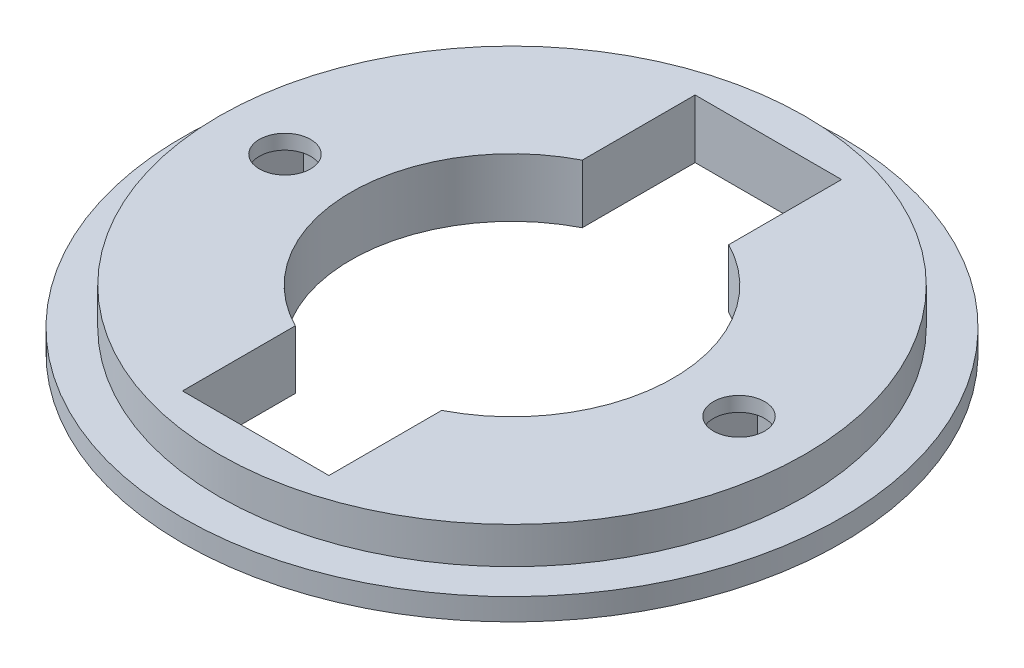
ISO-10303-21;
HEADER;
FILE_DESCRIPTION(('STEP AP214'),'2;1');
FILE_NAME('part.step','',(''),(''),'','','');
FILE_SCHEMA(('AUTOMOTIVE_DESIGN { 1 0 10303 214 1 1 1 1 }'));
ENDSEC;
DATA;
#1=APPLICATION_CONTEXT('core data for automotive mechanical design processes');
#2=APPLICATION_PROTOCOL_DEFINITION('international standard','automotive_design',2000,#1);
#3=PRODUCT_CONTEXT('',#1,'mechanical');
#4=PRODUCT('Part','Part','',(#3));
#5=PRODUCT_RELATED_PRODUCT_CATEGORY('part','',(#4));
#6=PRODUCT_DEFINITION_FORMATION('','',#4);
#7=PRODUCT_DEFINITION_CONTEXT('part definition',#1,'design');
#8=PRODUCT_DEFINITION('design','',#6,#7);
#9=PRODUCT_DEFINITION_SHAPE('','',#8);
#10=(LENGTH_UNIT() NAMED_UNIT(*) SI_UNIT(.MILLI.,.METRE.));
#11=(NAMED_UNIT(*) PLANE_ANGLE_UNIT() SI_UNIT($,.RADIAN.));
#12=(NAMED_UNIT(*) SI_UNIT($,.STERADIAN.) SOLID_ANGLE_UNIT());
#13=UNCERTAINTY_MEASURE_WITH_UNIT(LENGTH_MEASURE(1.E-05),#10,'distance_accuracy_value','');
#14=(GEOMETRIC_REPRESENTATION_CONTEXT(3) GLOBAL_UNCERTAINTY_ASSIGNED_CONTEXT((#13)) GLOBAL_UNIT_ASSIGNED_CONTEXT((#10,
#11,#12)) REPRESENTATION_CONTEXT('',''));
#15=CARTESIAN_POINT('',(0.,0.,0.));
#16=DIRECTION('',(0.,0.,1.));
#17=DIRECTION('',(1.,0.,0.));
#18=AXIS2_PLACEMENT_3D('',#15,#16,#17);
#19=CARTESIAN_POINT('',(-15.5,0.,0.));
#20=DIRECTION('',(0.,1.,0.));
#21=DIRECTION('',(0.,0.,1.));
#22=AXIS2_PLACEMENT_3D('',#19,#20,#21);
#23=CYLINDRICAL_SURFACE('',#22,1.75);
#24=CARTESIAN_POINT('',(-15.5,4.,0.));
#25=DIRECTION('',(0.,1.,0.));
#26=DIRECTION('',(0.,0.,-1.));
#27=AXIS2_PLACEMENT_3D('',#24,#25,#26);
#28=CIRCLE('',#27,1.75);
#29=CARTESIAN_POINT('',(-15.5,4.,-1.75));
#30=VERTEX_POINT('',#29);
#31=EDGE_CURVE('E274',#30,#30,#28,.T.);
#32=ORIENTED_EDGE('',*,*,#31,.T.);
#33=EDGE_LOOP('',(#32));
#34=FACE_BOUND('',#33,.T.);
#35=CARTESIAN_POINT('',(-15.5,3.,0.));
#36=DIRECTION('',(0.,-1.,0.));
#37=DIRECTION('',(0.,0.,-1.));
#38=AXIS2_PLACEMENT_3D('',#35,#36,#37);
#39=CIRCLE('',#38,1.75);
#40=CARTESIAN_POINT('',(-15.5,3.,-1.75));
#41=VERTEX_POINT('',#40);
#42=EDGE_CURVE('E264',#41,#41,#39,.F.);
#43=ORIENTED_EDGE('',*,*,#42,.F.);
#44=EDGE_LOOP('',(#43));
#45=FACE_BOUND('',#44,.T.);
#46=ADVANCED_FACE('F33',(#34,#45),#23,.F.);
#47=CARTESIAN_POINT('',(0.,4.,0.));
#48=DIRECTION('',(0.,-1.,0.));
#49=DIRECTION('',(0.,0.,-1.));
#50=AXIS2_PLACEMENT_3D('',#47,#48,#49);
#51=CYLINDRICAL_SURFACE('',#50,22.5);
#52=CARTESIAN_POINT('',(0.,0.,0.));
#53=DIRECTION('',(0.,1.,0.));
#54=DIRECTION('',(0.,0.,1.));
#55=AXIS2_PLACEMENT_3D('',#52,#53,#54);
#56=CIRCLE('',#55,22.5);
#57=CARTESIAN_POINT('',(0.,0.,22.5));
#58=VERTEX_POINT('',#57);
#59=EDGE_CURVE('E11',#58,#58,#56,.T.);
#60=ORIENTED_EDGE('',*,*,#59,.T.);
#61=EDGE_LOOP('',(#60));
#62=FACE_BOUND('',#61,.T.);
#63=CARTESIAN_POINT('',(0.,1.5,0.));
#64=DIRECTION('',(0.,1.,0.));
#65=DIRECTION('',(0.,0.,1.));
#66=AXIS2_PLACEMENT_3D('',#63,#64,#65);
#67=CIRCLE('',#66,22.5);
#68=CARTESIAN_POINT('',(0.,1.5,22.5));
#69=VERTEX_POINT('',#68);
#70=EDGE_CURVE('E42',#69,#69,#67,.T.);
#71=ORIENTED_EDGE('',*,*,#70,.F.);
#72=EDGE_LOOP('',(#71));
#73=FACE_BOUND('',#72,.T.);
#74=ADVANCED_FACE('F35',(#62,#73),#51,.T.);
#75=CARTESIAN_POINT('',(0.,0.,0.));
#76=DIRECTION('',(0.,1.,0.));
#77=DIRECTION('',(0.,0.,1.));
#78=AXIS2_PLACEMENT_3D('',#75,#76,#77);
#79=PLANE('',#78);
#80=DIRECTION('',(0.500000000000001,0.,0.866025403784438));
#81=VECTOR('',#80,1.);
#82=CARTESIAN_POINT('',(18.9641016151377,0.,0.));
#83=LINE('',#82,#81);
#84=CARTESIAN_POINT('',(17.2320508075689,0.,-3.));
#85=VERTEX_POINT('',#84);
#86=CARTESIAN_POINT('',(18.9641016151377,0.,0.));
#87=VERTEX_POINT('',#86);
#88=EDGE_CURVE('E208',#85,#87,#83,.T.);
#89=ORIENTED_EDGE('',*,*,#88,.F.);
#90=DIRECTION('',(1.,0.,0.));
#91=VECTOR('',#90,1.);
#92=CARTESIAN_POINT('',(17.2320508075689,0.,-3.));
#93=LINE('',#92,#91);
#94=CARTESIAN_POINT('',(13.7679491924311,0.,-3.));
#95=VERTEX_POINT('',#94);
#96=EDGE_CURVE('E50',#95,#85,#93,.T.);
#97=ORIENTED_EDGE('',*,*,#96,.F.);
#98=DIRECTION('',(0.5,0.,-0.866025403784439));
#99=VECTOR('',#98,1.);
#100=CARTESIAN_POINT('',(13.7679491924311,0.,-3.));
#101=LINE('',#100,#99);
#102=CARTESIAN_POINT('',(12.0358983848622,0.,0.));
#103=VERTEX_POINT('',#102);
#104=EDGE_CURVE('E194',#103,#95,#101,.T.);
#105=ORIENTED_EDGE('',*,*,#104,.F.);
#106=DIRECTION('',(-0.5,0.,-0.866025403784438));
#107=VECTOR('',#106,1.);
#108=CARTESIAN_POINT('',(12.0358983848622,0.,0.));
#109=LINE('',#108,#107);
#110=CARTESIAN_POINT('',(13.7679491924311,0.,2.99999999999999));
#111=VERTEX_POINT('',#110);
#112=EDGE_CURVE('E197',#111,#103,#109,.T.);
#113=ORIENTED_EDGE('',*,*,#112,.F.);
#114=DIRECTION('',(-1.,0.,0.));
#115=VECTOR('',#114,1.);
#116=CARTESIAN_POINT('',(13.7679491924311,0.,2.99999999999999));
#117=LINE('',#116,#115);
#118=CARTESIAN_POINT('',(17.2320508075689,0.,2.99999999999999));
#119=VERTEX_POINT('',#118);
#120=EDGE_CURVE('E213',#119,#111,#117,.T.);
#121=ORIENTED_EDGE('',*,*,#120,.F.);
#122=DIRECTION('',(-0.5,0.,0.866025403784439));
#123=VECTOR('',#122,1.);
#124=CARTESIAN_POINT('',(17.2320508075689,0.,2.99999999999999));
#125=LINE('',#124,#123);
#126=EDGE_CURVE('E210',#87,#119,#125,.T.);
#127=ORIENTED_EDGE('',*,*,#126,.F.);
#128=EDGE_LOOP('',(#89,#97,#105,#113,#121,#127));
#129=FACE_BOUND('',#128,.T.);
#130=DIRECTION('',(-0.5,0.,0.866025403784438));
#131=VECTOR('',#130,1.);
#132=CARTESIAN_POINT('',(-12.0358983848622,0.,0.));
#133=LINE('',#132,#131);
#134=CARTESIAN_POINT('',(-12.0358983848622,0.,0.));
#135=VERTEX_POINT('',#134);
#136=CARTESIAN_POINT('',(-13.7679491924311,0.,2.99999999999999));
#137=VERTEX_POINT('',#136);
#138=EDGE_CURVE('E248',#135,#137,#133,.T.);
#139=ORIENTED_EDGE('',*,*,#138,.F.);
#140=DIRECTION('',(0.5,0.,0.866025403784439));
#141=VECTOR('',#140,1.);
#142=CARTESIAN_POINT('',(-13.7679491924311,0.,-3.));
#143=LINE('',#142,#141);
#144=CARTESIAN_POINT('',(-13.7679491924311,0.,-3.));
#145=VERTEX_POINT('',#144);
#146=EDGE_CURVE('E58',#145,#135,#143,.T.);
#147=ORIENTED_EDGE('',*,*,#146,.F.);
#148=DIRECTION('',(1.,0.,0.));
#149=VECTOR('',#148,1.);
#150=CARTESIAN_POINT('',(-17.2320508075689,0.,-3.));
#151=LINE('',#150,#149);
#152=CARTESIAN_POINT('',(-17.2320508075689,0.,-3.));
#153=VERTEX_POINT('',#152);
#154=EDGE_CURVE('E231',#153,#145,#151,.T.);
#155=ORIENTED_EDGE('',*,*,#154,.F.);
#156=DIRECTION('',(0.500000000000001,0.,-0.866025403784438));
#157=VECTOR('',#156,1.);
#158=CARTESIAN_POINT('',(-18.9641016151377,0.,0.));
#159=LINE('',#158,#157);
#160=CARTESIAN_POINT('',(-18.9641016151377,0.,0.));
#161=VERTEX_POINT('',#160);
#162=EDGE_CURVE('E257',#161,#153,#159,.T.);
#163=ORIENTED_EDGE('',*,*,#162,.F.);
#164=DIRECTION('',(-0.5,0.,-0.866025403784439));
#165=VECTOR('',#164,1.);
#166=CARTESIAN_POINT('',(-17.2320508075689,0.,2.99999999999999));
#167=LINE('',#166,#165);
#168=CARTESIAN_POINT('',(-17.2320508075689,0.,2.99999999999999));
#169=VERTEX_POINT('',#168);
#170=EDGE_CURVE('E254',#169,#161,#167,.T.);
#171=ORIENTED_EDGE('',*,*,#170,.F.);
#172=DIRECTION('',(-1.,0.,0.));
#173=VECTOR('',#172,1.);
#174=CARTESIAN_POINT('',(-13.7679491924311,0.,2.99999999999999));
#175=LINE('',#174,#173);
#176=EDGE_CURVE('E251',#137,#169,#175,.T.);
#177=ORIENTED_EDGE('',*,*,#176,.F.);
#178=EDGE_LOOP('',(#139,#147,#155,#163,#171,#177));
#179=FACE_BOUND('',#178,.T.);
#180=DIRECTION('',(0.,0.,1.));
#181=VECTOR('',#180,1.);
#182=CARTESIAN_POINT('',(-5.,0.,9.79795897113272));
#183=LINE('',#182,#181);
#184=CARTESIAN_POINT('',(-5.,0.,9.79795897113271));
#185=VERTEX_POINT('',#184);
#186=CARTESIAN_POINT('',(-5.,0.,17.5));
#187=VERTEX_POINT('',#186);
#188=EDGE_CURVE('E303',#185,#187,#183,.T.);
#189=ORIENTED_EDGE('',*,*,#188,.T.);
#190=DIRECTION('',(1.,0.,0.));
#191=VECTOR('',#190,1.);
#192=CARTESIAN_POINT('',(-5.,0.,17.5));
#193=LINE('',#192,#191);
#194=CARTESIAN_POINT('',(5.,0.,17.5));
#195=VERTEX_POINT('',#194);
#196=EDGE_CURVE('E281',#187,#195,#193,.T.);
#197=ORIENTED_EDGE('',*,*,#196,.T.);
#198=DIRECTION('',(0.,0.,-1.));
#199=VECTOR('',#198,1.);
#200=CARTESIAN_POINT('',(5.,0.,9.79795897113272));
#201=LINE('',#200,#199);
#202=CARTESIAN_POINT('',(5.,0.,9.79795897113272));
#203=VERTEX_POINT('',#202);
#204=EDGE_CURVE('E284',#195,#203,#201,.T.);
#205=ORIENTED_EDGE('',*,*,#204,.T.);
#206=CARTESIAN_POINT('',(0.,0.,0.));
#207=DIRECTION('',(0.,1.,0.));
#208=DIRECTION('',(0.,0.,1.));
#209=AXIS2_PLACEMENT_3D('',#206,#207,#208);
#210=CIRCLE('',#209,11.);
#211=CARTESIAN_POINT('',(5.,0.,-9.79795897113272));
#212=VERTEX_POINT('',#211);
#213=EDGE_CURVE('E288',#203,#212,#210,.T.);
#214=ORIENTED_EDGE('',*,*,#213,.T.);
#215=DIRECTION('',(0.,0.,-1.));
#216=VECTOR('',#215,1.);
#217=CARTESIAN_POINT('',(5.,0.,-17.5));
#218=LINE('',#217,#216);
#219=CARTESIAN_POINT('',(5.,0.,-17.5));
#220=VERTEX_POINT('',#219);
#221=EDGE_CURVE('E291',#212,#220,#218,.T.);
#222=ORIENTED_EDGE('',*,*,#221,.T.);
#223=DIRECTION('',(-1.,0.,0.));
#224=VECTOR('',#223,1.);
#225=CARTESIAN_POINT('',(-5.,0.,-17.5));
#226=LINE('',#225,#224);
#227=CARTESIAN_POINT('',(-5.,0.,-17.5));
#228=VERTEX_POINT('',#227);
#229=EDGE_CURVE('E294',#220,#228,#226,.T.);
#230=ORIENTED_EDGE('',*,*,#229,.T.);
#231=DIRECTION('',(0.,0.,1.));
#232=VECTOR('',#231,1.);
#233=CARTESIAN_POINT('',(-5.,0.,-17.5));
#234=LINE('',#233,#232);
#235=CARTESIAN_POINT('',(-5.,0.,-9.79795897113271));
#236=VERTEX_POINT('',#235);
#237=EDGE_CURVE('E297',#228,#236,#234,.T.);
#238=ORIENTED_EDGE('',*,*,#237,.T.);
#239=CARTESIAN_POINT('',(0.,0.,0.));
#240=DIRECTION('',(0.,1.,0.));
#241=DIRECTION('',(0.,0.,1.));
#242=AXIS2_PLACEMENT_3D('',#239,#240,#241);
#243=CIRCLE('',#242,11.);
#244=EDGE_CURVE('E300',#236,#185,#243,.T.);
#245=ORIENTED_EDGE('',*,*,#244,.T.);
#246=EDGE_LOOP('',(#189,#197,#205,#214,#222,#230,#238,#245));
#247=FACE_BOUND('',#246,.T.);
#248=ORIENTED_EDGE('',*,*,#59,.F.);
#249=EDGE_LOOP('',(#248));
#250=FACE_BOUND('',#249,.T.);
#251=ADVANCED_FACE('F364',(#129,#179,#247,#250),#79,.F.);
#252=CARTESIAN_POINT('',(0.,1.5,0.));
#253=DIRECTION('',(0.,1.,0.));
#254=DIRECTION('',(0.,0.,1.));
#255=AXIS2_PLACEMENT_3D('',#252,#253,#254);
#256=PLANE('',#255);
#257=CARTESIAN_POINT('',(0.,1.5,0.));
#258=DIRECTION('',(0.,1.,0.));
#259=DIRECTION('',(0.,0.,1.));
#260=AXIS2_PLACEMENT_3D('',#257,#258,#259);
#261=CIRCLE('',#260,20.);
#262=CARTESIAN_POINT('',(0.,1.5,20.));
#263=VERTEX_POINT('',#262);
#264=EDGE_CURVE('E345',#263,#263,#261,.T.);
#265=ORIENTED_EDGE('',*,*,#264,.F.);
#266=EDGE_LOOP('',(#265));
#267=FACE_BOUND('',#266,.T.);
#268=ORIENTED_EDGE('',*,*,#70,.T.);
#269=EDGE_LOOP('',(#268));
#270=FACE_BOUND('',#269,.T.);
#271=ADVANCED_FACE('F408',(#267,#270),#256,.T.);
#272=CARTESIAN_POINT('',(0.,1.5,0.));
#273=DIRECTION('',(0.,1.,0.));
#274=DIRECTION('',(0.,0.,1.));
#275=AXIS2_PLACEMENT_3D('',#272,#273,#274);
#276=CYLINDRICAL_SURFACE('',#275,20.);
#277=ORIENTED_EDGE('',*,*,#264,.T.);
#278=EDGE_LOOP('',(#277));
#279=FACE_BOUND('',#278,.T.);
#280=CARTESIAN_POINT('',(0.,4.,0.));
#281=DIRECTION('',(0.,1.,0.));
#282=DIRECTION('',(0.,0.,1.));
#283=AXIS2_PLACEMENT_3D('',#280,#281,#282);
#284=CIRCLE('',#283,20.);
#285=CARTESIAN_POINT('',(0.,4.,20.));
#286=VERTEX_POINT('',#285);
#287=EDGE_CURVE('E330',#286,#286,#284,.T.);
#288=ORIENTED_EDGE('',*,*,#287,.F.);
#289=EDGE_LOOP('',(#288));
#290=FACE_BOUND('',#289,.T.);
#291=ADVANCED_FACE('F405',(#279,#290),#276,.T.);
#292=CARTESIAN_POINT('',(0.,4.,0.));
#293=DIRECTION('',(0.,1.,0.));
#294=DIRECTION('',(0.,0.,1.));
#295=AXIS2_PLACEMENT_3D('',#292,#293,#294);
#296=PLANE('',#295);
#297=ORIENTED_EDGE('',*,*,#31,.F.);
#298=EDGE_LOOP('',(#297));
#299=FACE_BOUND('',#298,.T.);
#300=CARTESIAN_POINT('',(15.5,4.,0.));
#301=DIRECTION('',(0.,1.,0.));
#302=DIRECTION('',(0.,0.,1.));
#303=AXIS2_PLACEMENT_3D('',#300,#301,#302);
#304=CIRCLE('',#303,1.75);
#305=CARTESIAN_POINT('',(15.5,4.,1.75));
#306=VERTEX_POINT('',#305);
#307=EDGE_CURVE('E277',#306,#306,#304,.T.);
#308=ORIENTED_EDGE('',*,*,#307,.F.);
#309=EDGE_LOOP('',(#308));
#310=FACE_BOUND('',#309,.T.);
#311=DIRECTION('',(1.,0.,0.));
#312=VECTOR('',#311,1.);
#313=CARTESIAN_POINT('',(-5.,4.,17.5));
#314=LINE('',#313,#312);
#315=CARTESIAN_POINT('',(-5.,4.,17.5));
#316=VERTEX_POINT('',#315);
#317=CARTESIAN_POINT('',(5.,4.,17.5));
#318=VERTEX_POINT('',#317);
#319=EDGE_CURVE('E280',#316,#318,#314,.T.);
#320=ORIENTED_EDGE('',*,*,#319,.F.);
#321=DIRECTION('',(0.,0.,1.));
#322=VECTOR('',#321,1.);
#323=CARTESIAN_POINT('',(-5.,4.,9.79795897113272));
#324=LINE('',#323,#322);
#325=CARTESIAN_POINT('',(-5.,4.,9.79795897113271));
#326=VERTEX_POINT('',#325);
#327=EDGE_CURVE('E285',#326,#316,#324,.T.);
#328=ORIENTED_EDGE('',*,*,#327,.F.);
#329=CARTESIAN_POINT('',(0.,4.,0.));
#330=DIRECTION('',(0.,1.,0.));
#331=DIRECTION('',(0.,0.,1.));
#332=AXIS2_PLACEMENT_3D('',#329,#330,#331);
#333=CIRCLE('',#332,11.);
#334=CARTESIAN_POINT('',(-5.,4.,-9.79795897113271));
#335=VERTEX_POINT('',#334);
#336=EDGE_CURVE('E323',#335,#326,#333,.T.);
#337=ORIENTED_EDGE('',*,*,#336,.F.);
#338=DIRECTION('',(0.,0.,1.));
#339=VECTOR('',#338,1.);
#340=CARTESIAN_POINT('',(-5.,4.,-17.5));
#341=LINE('',#340,#339);
#342=CARTESIAN_POINT('',(-5.,4.,-17.5));
#343=VERTEX_POINT('',#342);
#344=EDGE_CURVE('E320',#343,#335,#341,.T.);
#345=ORIENTED_EDGE('',*,*,#344,.F.);
#346=DIRECTION('',(-1.,0.,0.));
#347=VECTOR('',#346,1.);
#348=CARTESIAN_POINT('',(-5.,4.,-17.5));
#349=LINE('',#348,#347);
#350=CARTESIAN_POINT('',(5.,4.,-17.5));
#351=VERTEX_POINT('',#350);
#352=EDGE_CURVE('E317',#351,#343,#349,.T.);
#353=ORIENTED_EDGE('',*,*,#352,.F.);
#354=DIRECTION('',(0.,0.,-1.));
#355=VECTOR('',#354,1.);
#356=CARTESIAN_POINT('',(5.,4.,-17.5));
#357=LINE('',#356,#355);
#358=CARTESIAN_POINT('',(5.,4.,-9.79795897113272));
#359=VERTEX_POINT('',#358);
#360=EDGE_CURVE('E314',#359,#351,#357,.T.);
#361=ORIENTED_EDGE('',*,*,#360,.F.);
#362=CARTESIAN_POINT('',(0.,4.,0.));
#363=DIRECTION('',(0.,1.,0.));
#364=DIRECTION('',(0.,0.,1.));
#365=AXIS2_PLACEMENT_3D('',#362,#363,#364);
#366=CIRCLE('',#365,11.);
#367=CARTESIAN_POINT('',(5.,4.,9.79795897113272));
#368=VERTEX_POINT('',#367);
#369=EDGE_CURVE('E311',#368,#359,#366,.T.);
#370=ORIENTED_EDGE('',*,*,#369,.F.);
#371=DIRECTION('',(0.,0.,-1.));
#372=VECTOR('',#371,1.);
#373=CARTESIAN_POINT('',(5.,4.,9.79795897113272));
#374=LINE('',#373,#372);
#375=EDGE_CURVE('E308',#318,#368,#374,.T.);
#376=ORIENTED_EDGE('',*,*,#375,.F.);
#377=EDGE_LOOP('',(#320,#328,#337,#345,#353,#361,#370,#376));
#378=FACE_BOUND('',#377,.T.);
#379=ORIENTED_EDGE('',*,*,#287,.T.);
#380=EDGE_LOOP('',(#379));
#381=FACE_BOUND('',#380,.T.);
#382=ADVANCED_FACE('F403',(#299,#310,#378,#381),#296,.T.);
#383=CARTESIAN_POINT('',(-5.,0.,17.5));
#384=DIRECTION('',(0.,0.,1.));
#385=DIRECTION('',(1.,0.,0.));
#386=AXIS2_PLACEMENT_3D('',#383,#384,#385);
#387=PLANE('',#386);
#388=ORIENTED_EDGE('',*,*,#319,.T.);
#389=DIRECTION('',(0.,1.,0.));
#390=VECTOR('',#389,1.);
#391=CARTESIAN_POINT('',(5.,0.,17.5));
#392=LINE('',#391,#390);
#393=EDGE_CURVE('E306',#195,#318,#392,.T.);
#394=ORIENTED_EDGE('',*,*,#393,.F.);
#395=ORIENTED_EDGE('',*,*,#196,.F.);
#396=DIRECTION('',(0.,1.,0.));
#397=VECTOR('',#396,1.);
#398=CARTESIAN_POINT('',(-5.,0.,17.5));
#399=LINE('',#398,#397);
#400=EDGE_CURVE('E328',#187,#316,#399,.T.);
#401=ORIENTED_EDGE('',*,*,#400,.T.);
#402=EDGE_LOOP('',(#388,#394,#395,#401));
#403=FACE_BOUND('',#402,.T.);
#404=ADVANCED_FACE('F378',(#403),#387,.F.);
#405=CARTESIAN_POINT('',(-5.,0.,9.79795897113272));
#406=DIRECTION('',(-1.,0.,0.));
#407=DIRECTION('',(0.,0.,1.));
#408=AXIS2_PLACEMENT_3D('',#405,#406,#407);
#409=PLANE('',#408);
#410=ORIENTED_EDGE('',*,*,#327,.T.);
#411=ORIENTED_EDGE('',*,*,#400,.F.);
#412=ORIENTED_EDGE('',*,*,#188,.F.);
#413=DIRECTION('',(0.,1.,0.));
#414=VECTOR('',#413,1.);
#415=CARTESIAN_POINT('',(-5.,0.,9.79795897113271));
#416=LINE('',#415,#414);
#417=EDGE_CURVE('E331',#185,#326,#416,.T.);
#418=ORIENTED_EDGE('',*,*,#417,.T.);
#419=EDGE_LOOP('',(#410,#411,#412,#418));
#420=FACE_BOUND('',#419,.T.);
#421=ADVANCED_FACE('F374',(#420),#409,.F.);
#422=CARTESIAN_POINT('',(0.,0.,0.));
#423=DIRECTION('',(0.,1.,0.));
#424=DIRECTION('',(0.,0.,1.));
#425=AXIS2_PLACEMENT_3D('',#422,#423,#424);
#426=CYLINDRICAL_SURFACE('',#425,11.);
#427=ORIENTED_EDGE('',*,*,#336,.T.);
#428=ORIENTED_EDGE('',*,*,#417,.F.);
#429=ORIENTED_EDGE('',*,*,#244,.F.);
#430=DIRECTION('',(0.,1.,0.));
#431=VECTOR('',#430,1.);
#432=CARTESIAN_POINT('',(-5.,0.,-9.79795897113271));
#433=LINE('',#432,#431);
#434=EDGE_CURVE('E333',#236,#335,#433,.T.);
#435=ORIENTED_EDGE('',*,*,#434,.T.);
#436=EDGE_LOOP('',(#427,#428,#429,#435));
#437=FACE_BOUND('',#436,.T.);
#438=ADVANCED_FACE('F377',(#437),#426,.F.);
#439=CARTESIAN_POINT('',(-5.,0.,-17.5));
#440=DIRECTION('',(-1.,0.,0.));
#441=DIRECTION('',(0.,0.,1.));
#442=AXIS2_PLACEMENT_3D('',#439,#440,#441);
#443=PLANE('',#442);
#444=ORIENTED_EDGE('',*,*,#344,.T.);
#445=ORIENTED_EDGE('',*,*,#434,.F.);
#446=ORIENTED_EDGE('',*,*,#237,.F.);
#447=DIRECTION('',(0.,1.,0.));
#448=VECTOR('',#447,1.);
#449=CARTESIAN_POINT('',(-5.,0.,-17.5));
#450=LINE('',#449,#448);
#451=EDGE_CURVE('E335',#228,#343,#450,.T.);
#452=ORIENTED_EDGE('',*,*,#451,.T.);
#453=EDGE_LOOP('',(#444,#445,#446,#452));
#454=FACE_BOUND('',#453,.T.);
#455=ADVANCED_FACE('F382',(#454),#443,.F.);
#456=CARTESIAN_POINT('',(-5.,0.,-17.5));
#457=DIRECTION('',(0.,0.,-1.));
#458=DIRECTION('',(-1.,0.,0.));
#459=AXIS2_PLACEMENT_3D('',#456,#457,#458);
#460=PLANE('',#459);
#461=ORIENTED_EDGE('',*,*,#352,.T.);
#462=ORIENTED_EDGE('',*,*,#451,.F.);
#463=ORIENTED_EDGE('',*,*,#229,.F.);
#464=DIRECTION('',(0.,1.,0.));
#465=VECTOR('',#464,1.);
#466=CARTESIAN_POINT('',(5.,0.,-17.5));
#467=LINE('',#466,#465);
#468=EDGE_CURVE('E337',#220,#351,#467,.T.);
#469=ORIENTED_EDGE('',*,*,#468,.T.);
#470=EDGE_LOOP('',(#461,#462,#463,#469));
#471=FACE_BOUND('',#470,.T.);
#472=ADVANCED_FACE('F386',(#471),#460,.F.);
#473=CARTESIAN_POINT('',(5.,0.,-17.5));
#474=DIRECTION('',(1.,0.,0.));
#475=DIRECTION('',(0.,0.,-1.));
#476=AXIS2_PLACEMENT_3D('',#473,#474,#475);
#477=PLANE('',#476);
#478=ORIENTED_EDGE('',*,*,#360,.T.);
#479=ORIENTED_EDGE('',*,*,#468,.F.);
#480=ORIENTED_EDGE('',*,*,#221,.F.);
#481=DIRECTION('',(0.,1.,0.));
#482=VECTOR('',#481,1.);
#483=CARTESIAN_POINT('',(5.,0.,-9.79795897113272));
#484=LINE('',#483,#482);
#485=EDGE_CURVE('E339',#212,#359,#484,.T.);
#486=ORIENTED_EDGE('',*,*,#485,.T.);
#487=EDGE_LOOP('',(#478,#479,#480,#486));
#488=FACE_BOUND('',#487,.T.);
#489=ADVANCED_FACE('F390',(#488),#477,.F.);
#490=CARTESIAN_POINT('',(0.,0.,0.));
#491=DIRECTION('',(0.,1.,0.));
#492=DIRECTION('',(0.,0.,1.));
#493=AXIS2_PLACEMENT_3D('',#490,#491,#492);
#494=CYLINDRICAL_SURFACE('',#493,11.);
#495=ORIENTED_EDGE('',*,*,#369,.T.);
#496=ORIENTED_EDGE('',*,*,#485,.F.);
#497=ORIENTED_EDGE('',*,*,#213,.F.);
#498=DIRECTION('',(0.,1.,0.));
#499=VECTOR('',#498,1.);
#500=CARTESIAN_POINT('',(5.,0.,9.79795897113272));
#501=LINE('',#500,#499);
#502=EDGE_CURVE('E341',#203,#368,#501,.T.);
#503=ORIENTED_EDGE('',*,*,#502,.T.);
#504=EDGE_LOOP('',(#495,#496,#497,#503));
#505=FACE_BOUND('',#504,.T.);
#506=ADVANCED_FACE('F394',(#505),#494,.F.);
#507=CARTESIAN_POINT('',(5.,0.,9.79795897113272));
#508=DIRECTION('',(1.,0.,0.));
#509=DIRECTION('',(0.,0.,-1.));
#510=AXIS2_PLACEMENT_3D('',#507,#508,#509);
#511=PLANE('',#510);
#512=ORIENTED_EDGE('',*,*,#375,.T.);
#513=ORIENTED_EDGE('',*,*,#502,.F.);
#514=ORIENTED_EDGE('',*,*,#204,.F.);
#515=ORIENTED_EDGE('',*,*,#393,.T.);
#516=EDGE_LOOP('',(#512,#513,#514,#515));
#517=FACE_BOUND('',#516,.T.);
#518=ADVANCED_FACE('F372',(#517),#511,.F.);
#519=CARTESIAN_POINT('',(15.5,0.,0.));
#520=DIRECTION('',(0.,1.,0.));
#521=DIRECTION('',(0.,0.,1.));
#522=AXIS2_PLACEMENT_3D('',#519,#520,#521);
#523=CYLINDRICAL_SURFACE('',#522,1.75);
#524=CARTESIAN_POINT('',(15.5,3.,0.));
#525=DIRECTION('',(0.,1.,0.));
#526=DIRECTION('',(0.,0.,1.));
#527=AXIS2_PLACEMENT_3D('',#524,#525,#526);
#528=CIRCLE('',#527,1.75);
#529=CARTESIAN_POINT('',(15.5,3.,1.75));
#530=VERTEX_POINT('',#529);
#531=EDGE_CURVE('E37',#530,#530,#528,.F.);
#532=ORIENTED_EDGE('',*,*,#531,.T.);
#533=EDGE_LOOP('',(#532));
#534=FACE_BOUND('',#533,.T.);
#535=ORIENTED_EDGE('',*,*,#307,.T.);
#536=EDGE_LOOP('',(#535));
#537=FACE_BOUND('',#536,.T.);
#538=ADVANCED_FACE('F370',(#534,#537),#523,.F.);
#539=CARTESIAN_POINT('',(0.,3.,0.));
#540=DIRECTION('',(0.,-1.,0.));
#541=DIRECTION('',(0.,0.,-1.));
#542=AXIS2_PLACEMENT_3D('',#539,#540,#541);
#543=PLANE('',#542);
#544=DIRECTION('',(0.5,0.,0.866025403784439));
#545=VECTOR('',#544,1.);
#546=CARTESIAN_POINT('',(-13.7679491924311,3.,-3.));
#547=LINE('',#546,#545);
#548=CARTESIAN_POINT('',(-13.7679491924311,3.,-3.));
#549=VERTEX_POINT('',#548);
#550=CARTESIAN_POINT('',(-12.0358983848622,3.,0.));
#551=VERTEX_POINT('',#550);
#552=EDGE_CURVE('E227',#549,#551,#547,.T.);
#553=ORIENTED_EDGE('',*,*,#552,.T.);
#554=DIRECTION('',(-0.5,0.,0.866025403784438));
#555=VECTOR('',#554,1.);
#556=CARTESIAN_POINT('',(-12.0358983848622,3.,0.));
#557=LINE('',#556,#555);
#558=CARTESIAN_POINT('',(-13.7679491924311,3.,2.99999999999999));
#559=VERTEX_POINT('',#558);
#560=EDGE_CURVE('E230',#551,#559,#557,.T.);
#561=ORIENTED_EDGE('',*,*,#560,.T.);
#562=DIRECTION('',(-1.,0.,0.));
#563=VECTOR('',#562,1.);
#564=CARTESIAN_POINT('',(-13.7679491924311,3.,2.99999999999999));
#565=LINE('',#564,#563);
#566=CARTESIAN_POINT('',(-17.2320508075689,3.,2.99999999999999));
#567=VERTEX_POINT('',#566);
#568=EDGE_CURVE('E234',#559,#567,#565,.T.);
#569=ORIENTED_EDGE('',*,*,#568,.T.);
#570=DIRECTION('',(-0.5,0.,-0.866025403784439));
#571=VECTOR('',#570,1.);
#572=CARTESIAN_POINT('',(-17.2320508075689,3.,2.99999999999999));
#573=LINE('',#572,#571);
#574=CARTESIAN_POINT('',(-18.9641016151377,3.,0.));
#575=VERTEX_POINT('',#574);
#576=EDGE_CURVE('E237',#567,#575,#573,.T.);
#577=ORIENTED_EDGE('',*,*,#576,.T.);
#578=DIRECTION('',(0.500000000000001,0.,-0.866025403784438));
#579=VECTOR('',#578,1.);
#580=CARTESIAN_POINT('',(-18.9641016151377,3.,0.));
#581=LINE('',#580,#579);
#582=CARTESIAN_POINT('',(-17.2320508075689,3.,-3.));
#583=VERTEX_POINT('',#582);
#584=EDGE_CURVE('E240',#575,#583,#581,.T.);
#585=ORIENTED_EDGE('',*,*,#584,.T.);
#586=DIRECTION('',(1.,0.,0.));
#587=VECTOR('',#586,1.);
#588=CARTESIAN_POINT('',(-17.2320508075689,3.,-3.));
#589=LINE('',#588,#587);
#590=EDGE_CURVE('E243',#583,#549,#589,.T.);
#591=ORIENTED_EDGE('',*,*,#590,.T.);
#592=EDGE_LOOP('',(#553,#561,#569,#577,#585,#591));
#593=FACE_BOUND('',#592,.T.);
#594=ORIENTED_EDGE('',*,*,#42,.T.);
#595=EDGE_LOOP('',(#594));
#596=FACE_BOUND('',#595,.T.);
#597=ADVANCED_FACE('F354',(#593,#596),#543,.T.);
#598=CARTESIAN_POINT('',(-13.7679491924311,3.,-3.));
#599=DIRECTION('',(0.866025403784439,0.,-0.5));
#600=DIRECTION('',(-0.5,0.,-0.866025403784439));
#601=AXIS2_PLACEMENT_3D('',#598,#599,#600);
#602=PLANE('',#601);
#603=ORIENTED_EDGE('',*,*,#146,.T.);
#604=DIRECTION('',(0.,-1.,0.));
#605=VECTOR('',#604,1.);
#606=CARTESIAN_POINT('',(-12.0358983848622,3.,0.));
#607=LINE('',#606,#605);
#608=EDGE_CURVE('E246',#551,#135,#607,.T.);
#609=ORIENTED_EDGE('',*,*,#608,.F.);
#610=ORIENTED_EDGE('',*,*,#552,.F.);
#611=DIRECTION('',(0.,-1.,0.));
#612=VECTOR('',#611,1.);
#613=CARTESIAN_POINT('',(-13.7679491924311,3.,-3.));
#614=LINE('',#613,#612);
#615=EDGE_CURVE('E262',#549,#145,#614,.T.);
#616=ORIENTED_EDGE('',*,*,#615,.T.);
#617=EDGE_LOOP('',(#603,#609,#610,#616));
#618=FACE_BOUND('',#617,.T.);
#619=ADVANCED_FACE('F368',(#618),#602,.F.);
#620=CARTESIAN_POINT('',(-17.2320508075689,3.,-3.));
#621=DIRECTION('',(0.,0.,-1.));
#622=DIRECTION('',(-1.,0.,0.));
#623=AXIS2_PLACEMENT_3D('',#620,#621,#622);
#624=PLANE('',#623);
#625=ORIENTED_EDGE('',*,*,#154,.T.);
#626=ORIENTED_EDGE('',*,*,#615,.F.);
#627=ORIENTED_EDGE('',*,*,#590,.F.);
#628=DIRECTION('',(0.,-1.,0.));
#629=VECTOR('',#628,1.);
#630=CARTESIAN_POINT('',(-17.2320508075689,3.,-3.));
#631=LINE('',#630,#629);
#632=EDGE_CURVE('E265',#583,#153,#631,.T.);
#633=ORIENTED_EDGE('',*,*,#632,.T.);
#634=EDGE_LOOP('',(#625,#626,#627,#633));
#635=FACE_BOUND('',#634,.T.);
#636=ADVANCED_FACE('F461',(#635),#624,.F.);
#637=CARTESIAN_POINT('',(-18.9641016151377,3.,0.));
#638=DIRECTION('',(-0.866025403784438,0.,-0.500000000000001));
#639=DIRECTION('',(-0.500000000000001,0.,0.866025403784438));
#640=AXIS2_PLACEMENT_3D('',#637,#638,#639);
#641=PLANE('',#640);
#642=ORIENTED_EDGE('',*,*,#162,.T.);
#643=ORIENTED_EDGE('',*,*,#632,.F.);
#644=ORIENTED_EDGE('',*,*,#584,.F.);
#645=DIRECTION('',(0.,-1.,0.));
#646=VECTOR('',#645,1.);
#647=CARTESIAN_POINT('',(-18.9641016151377,3.,0.));
#648=LINE('',#647,#646);
#649=EDGE_CURVE('E267',#575,#161,#648,.T.);
#650=ORIENTED_EDGE('',*,*,#649,.T.);
#651=EDGE_LOOP('',(#642,#643,#644,#650));
#652=FACE_BOUND('',#651,.T.);
#653=ADVANCED_FACE('F464',(#652),#641,.F.);
#654=CARTESIAN_POINT('',(-17.2320508075689,3.,2.99999999999999));
#655=DIRECTION('',(-0.866025403784438,0.,0.5));
#656=DIRECTION('',(0.5,0.,0.866025403784439));
#657=AXIS2_PLACEMENT_3D('',#654,#655,#656);
#658=PLANE('',#657);
#659=ORIENTED_EDGE('',*,*,#170,.T.);
#660=ORIENTED_EDGE('',*,*,#649,.F.);
#661=ORIENTED_EDGE('',*,*,#576,.F.);
#662=DIRECTION('',(0.,-1.,0.));
#663=VECTOR('',#662,1.);
#664=CARTESIAN_POINT('',(-17.2320508075689,3.,2.99999999999999));
#665=LINE('',#664,#663);
#666=EDGE_CURVE('E269',#567,#169,#665,.T.);
#667=ORIENTED_EDGE('',*,*,#666,.T.);
#668=EDGE_LOOP('',(#659,#660,#661,#667));
#669=FACE_BOUND('',#668,.T.);
#670=ADVANCED_FACE('F467',(#669),#658,.F.);
#671=CARTESIAN_POINT('',(-13.7679491924311,3.,2.99999999999999));
#672=DIRECTION('',(0.,0.,1.));
#673=DIRECTION('',(1.,0.,0.));
#674=AXIS2_PLACEMENT_3D('',#671,#672,#673);
#675=PLANE('',#674);
#676=ORIENTED_EDGE('',*,*,#176,.T.);
#677=ORIENTED_EDGE('',*,*,#666,.F.);
#678=ORIENTED_EDGE('',*,*,#568,.F.);
#679=DIRECTION('',(0.,-1.,0.));
#680=VECTOR('',#679,1.);
#681=CARTESIAN_POINT('',(-13.7679491924311,3.,2.99999999999999));
#682=LINE('',#681,#680);
#683=EDGE_CURVE('E271',#559,#137,#682,.T.);
#684=ORIENTED_EDGE('',*,*,#683,.T.);
#685=EDGE_LOOP('',(#676,#677,#678,#684));
#686=FACE_BOUND('',#685,.T.);
#687=ADVANCED_FACE('F469',(#686),#675,.F.);
#688=CARTESIAN_POINT('',(-12.0358983848622,3.,0.));
#689=DIRECTION('',(0.866025403784438,0.,0.500000000000001));
#690=DIRECTION('',(0.500000000000001,0.,-0.866025403784438));
#691=AXIS2_PLACEMENT_3D('',#688,#689,#690);
#692=PLANE('',#691);
#693=ORIENTED_EDGE('',*,*,#138,.T.);
#694=ORIENTED_EDGE('',*,*,#683,.F.);
#695=ORIENTED_EDGE('',*,*,#560,.F.);
#696=ORIENTED_EDGE('',*,*,#608,.T.);
#697=EDGE_LOOP('',(#693,#694,#695,#696));
#698=FACE_BOUND('',#697,.T.);
#699=ADVANCED_FACE('F453',(#698),#692,.F.);
#700=CARTESIAN_POINT('',(0.,3.,0.));
#701=DIRECTION('',(0.,1.,0.));
#702=DIRECTION('',(0.,0.,1.));
#703=AXIS2_PLACEMENT_3D('',#700,#701,#702);
#704=PLANE('',#703);
#705=DIRECTION('',(1.,0.,0.));
#706=VECTOR('',#705,1.);
#707=CARTESIAN_POINT('',(17.2320508075689,3.,-3.));
#708=LINE('',#707,#706);
#709=CARTESIAN_POINT('',(13.7679491924311,3.,-3.));
#710=VERTEX_POINT('',#709);
#711=CARTESIAN_POINT('',(17.2320508075689,3.,-3.));
#712=VERTEX_POINT('',#711);
#713=EDGE_CURVE('E174',#710,#712,#708,.T.);
#714=ORIENTED_EDGE('',*,*,#713,.T.);
#715=DIRECTION('',(0.500000000000001,0.,0.866025403784438));
#716=VECTOR('',#715,1.);
#717=CARTESIAN_POINT('',(18.9641016151377,3.,0.));
#718=LINE('',#717,#716);
#719=CARTESIAN_POINT('',(18.9641016151377,3.,0.));
#720=VERTEX_POINT('',#719);
#721=EDGE_CURVE('E183',#712,#720,#718,.T.);
#722=ORIENTED_EDGE('',*,*,#721,.T.);
#723=DIRECTION('',(-0.5,0.,0.866025403784439));
#724=VECTOR('',#723,1.);
#725=CARTESIAN_POINT('',(17.2320508075689,3.,2.99999999999999));
#726=LINE('',#725,#724);
#727=CARTESIAN_POINT('',(17.2320508075689,3.,2.99999999999999));
#728=VERTEX_POINT('',#727);
#729=EDGE_CURVE('E188',#720,#728,#726,.T.);
#730=ORIENTED_EDGE('',*,*,#729,.T.);
#731=DIRECTION('',(-1.,0.,0.));
#732=VECTOR('',#731,1.);
#733=CARTESIAN_POINT('',(13.7679491924311,3.,2.99999999999999));
#734=LINE('',#733,#732);
#735=CARTESIAN_POINT('',(13.7679491924311,3.,2.99999999999999));
#736=VERTEX_POINT('',#735);
#737=EDGE_CURVE('E201',#728,#736,#734,.T.);
#738=ORIENTED_EDGE('',*,*,#737,.T.);
#739=DIRECTION('',(-0.5,0.,-0.866025403784438));
#740=VECTOR('',#739,1.);
#741=CARTESIAN_POINT('',(12.0358983848622,3.,0.));
#742=LINE('',#741,#740);
#743=CARTESIAN_POINT('',(12.0358983848622,3.,0.));
#744=VERTEX_POINT('',#743);
#745=EDGE_CURVE('E204',#736,#744,#742,.T.);
#746=ORIENTED_EDGE('',*,*,#745,.T.);
#747=DIRECTION('',(0.5,0.,-0.866025403784439));
#748=VECTOR('',#747,1.);
#749=CARTESIAN_POINT('',(13.7679491924311,3.,-3.));
#750=LINE('',#749,#748);
#751=EDGE_CURVE('E180',#744,#710,#750,.T.);
#752=ORIENTED_EDGE('',*,*,#751,.T.);
#753=EDGE_LOOP('',(#714,#722,#730,#738,#746,#752));
#754=FACE_BOUND('',#753,.T.);
#755=ORIENTED_EDGE('',*,*,#531,.F.);
#756=EDGE_LOOP('',(#755));
#757=FACE_BOUND('',#756,.T.);
#758=ADVANCED_FACE('F190',(#754,#757),#704,.F.);
#759=CARTESIAN_POINT('',(17.2320508075689,3.,-3.));
#760=DIRECTION('',(0.,0.,-1.));
#761=DIRECTION('',(-1.,0.,0.));
#762=AXIS2_PLACEMENT_3D('',#759,#760,#761);
#763=PLANE('',#762);
#764=ORIENTED_EDGE('',*,*,#96,.T.);
#765=DIRECTION('',(0.,-1.,0.));
#766=VECTOR('',#765,1.);
#767=CARTESIAN_POINT('',(17.2320508075689,3.,-3.));
#768=LINE('',#767,#766);
#769=EDGE_CURVE('E170',#712,#85,#768,.T.);
#770=ORIENTED_EDGE('',*,*,#769,.F.);
#771=ORIENTED_EDGE('',*,*,#713,.F.);
#772=DIRECTION('',(0.,-1.,0.));
#773=VECTOR('',#772,1.);
#774=CARTESIAN_POINT('',(13.7679491924311,3.,-3.));
#775=LINE('',#774,#773);
#776=EDGE_CURVE('E218',#710,#95,#775,.T.);
#777=ORIENTED_EDGE('',*,*,#776,.T.);
#778=EDGE_LOOP('',(#764,#770,#771,#777));
#779=FACE_BOUND('',#778,.T.);
#780=ADVANCED_FACE('F172',(#779),#763,.F.);
#781=CARTESIAN_POINT('',(13.7679491924311,3.,-3.));
#782=DIRECTION('',(-0.866025403784439,0.,-0.5));
#783=DIRECTION('',(-0.5,0.,0.866025403784439));
#784=AXIS2_PLACEMENT_3D('',#781,#782,#783);
#785=PLANE('',#784);
#786=ORIENTED_EDGE('',*,*,#104,.T.);
#787=ORIENTED_EDGE('',*,*,#776,.F.);
#788=ORIENTED_EDGE('',*,*,#751,.F.);
#789=DIRECTION('',(0.,-1.,0.));
#790=VECTOR('',#789,1.);
#791=CARTESIAN_POINT('',(12.0358983848622,3.,0.));
#792=LINE('',#791,#790);
#793=EDGE_CURVE('E220',#744,#103,#792,.T.);
#794=ORIENTED_EDGE('',*,*,#793,.T.);
#795=EDGE_LOOP('',(#786,#787,#788,#794));
#796=FACE_BOUND('',#795,.T.);
#797=ADVANCED_FACE('F486',(#796),#785,.F.);
#798=CARTESIAN_POINT('',(12.0358983848622,3.,0.));
#799=DIRECTION('',(-0.866025403784438,0.,0.500000000000001));
#800=DIRECTION('',(0.500000000000001,0.,0.866025403784438));
#801=AXIS2_PLACEMENT_3D('',#798,#799,#800);
#802=PLANE('',#801);
#803=ORIENTED_EDGE('',*,*,#112,.T.);
#804=ORIENTED_EDGE('',*,*,#793,.F.);
#805=ORIENTED_EDGE('',*,*,#745,.F.);
#806=DIRECTION('',(0.,-1.,0.));
#807=VECTOR('',#806,1.);
#808=CARTESIAN_POINT('',(13.7679491924311,3.,2.99999999999999));
#809=LINE('',#808,#807);
#810=EDGE_CURVE('E222',#736,#111,#809,.T.);
#811=ORIENTED_EDGE('',*,*,#810,.T.);
#812=EDGE_LOOP('',(#803,#804,#805,#811));
#813=FACE_BOUND('',#812,.T.);
#814=ADVANCED_FACE('F496',(#813),#802,.F.);
#815=CARTESIAN_POINT('',(13.7679491924311,3.,2.99999999999999));
#816=DIRECTION('',(0.,0.,1.));
#817=DIRECTION('',(1.,0.,0.));
#818=AXIS2_PLACEMENT_3D('',#815,#816,#817);
#819=PLANE('',#818);
#820=ORIENTED_EDGE('',*,*,#120,.T.);
#821=ORIENTED_EDGE('',*,*,#810,.F.);
#822=ORIENTED_EDGE('',*,*,#737,.F.);
#823=DIRECTION('',(0.,-1.,0.));
#824=VECTOR('',#823,1.);
#825=CARTESIAN_POINT('',(17.2320508075689,3.,2.99999999999999));
#826=LINE('',#825,#824);
#827=EDGE_CURVE('E224',#728,#119,#826,.T.);
#828=ORIENTED_EDGE('',*,*,#827,.T.);
#829=EDGE_LOOP('',(#820,#821,#822,#828));
#830=FACE_BOUND('',#829,.T.);
#831=ADVANCED_FACE('F492',(#830),#819,.F.);
#832=CARTESIAN_POINT('',(17.2320508075689,3.,2.99999999999999));
#833=DIRECTION('',(0.866025403784438,0.,0.5));
#834=DIRECTION('',(0.5,0.,-0.866025403784439));
#835=AXIS2_PLACEMENT_3D('',#832,#833,#834);
#836=PLANE('',#835);
#837=ORIENTED_EDGE('',*,*,#126,.T.);
#838=ORIENTED_EDGE('',*,*,#827,.F.);
#839=ORIENTED_EDGE('',*,*,#729,.F.);
#840=DIRECTION('',(0.,-1.,0.));
#841=VECTOR('',#840,1.);
#842=CARTESIAN_POINT('',(18.9641016151377,3.,0.));
#843=LINE('',#842,#841);
#844=EDGE_CURVE('E179',#720,#87,#843,.T.);
#845=ORIENTED_EDGE('',*,*,#844,.T.);
#846=EDGE_LOOP('',(#837,#838,#839,#845));
#847=FACE_BOUND('',#846,.T.);
#848=ADVANCED_FACE('F489',(#847),#836,.F.);
#849=CARTESIAN_POINT('',(18.9641016151377,3.,0.));
#850=DIRECTION('',(0.866025403784438,0.,-0.500000000000001));
#851=DIRECTION('',(-0.500000000000001,0.,-0.866025403784438));
#852=AXIS2_PLACEMENT_3D('',#849,#850,#851);
#853=PLANE('',#852);
#854=ORIENTED_EDGE('',*,*,#88,.T.);
#855=ORIENTED_EDGE('',*,*,#844,.F.);
#856=ORIENTED_EDGE('',*,*,#721,.F.);
#857=ORIENTED_EDGE('',*,*,#769,.T.);
#858=EDGE_LOOP('',(#854,#855,#856,#857));
#859=FACE_BOUND('',#858,.T.);
#860=ADVANCED_FACE('F184',(#859),#853,.F.);
#861=CLOSED_SHELL('',(#46,#74,#251,#271,#291,#382,#404,#421,#438,#455,#472,#489,#506,#518,#538,
#597,#619,#636,#653,#670,#687,#699,#758,#780,#797,#814,#831,#848,#860));
#862=MANIFOLD_SOLID_BREP('B2',#861);
#863=ADVANCED_BREP_SHAPE_REPRESENTATION('',(#18,#862),#14);
#864=SHAPE_DEFINITION_REPRESENTATION(#9,#863);
ENDSEC;
END-ISO-10303-21;
